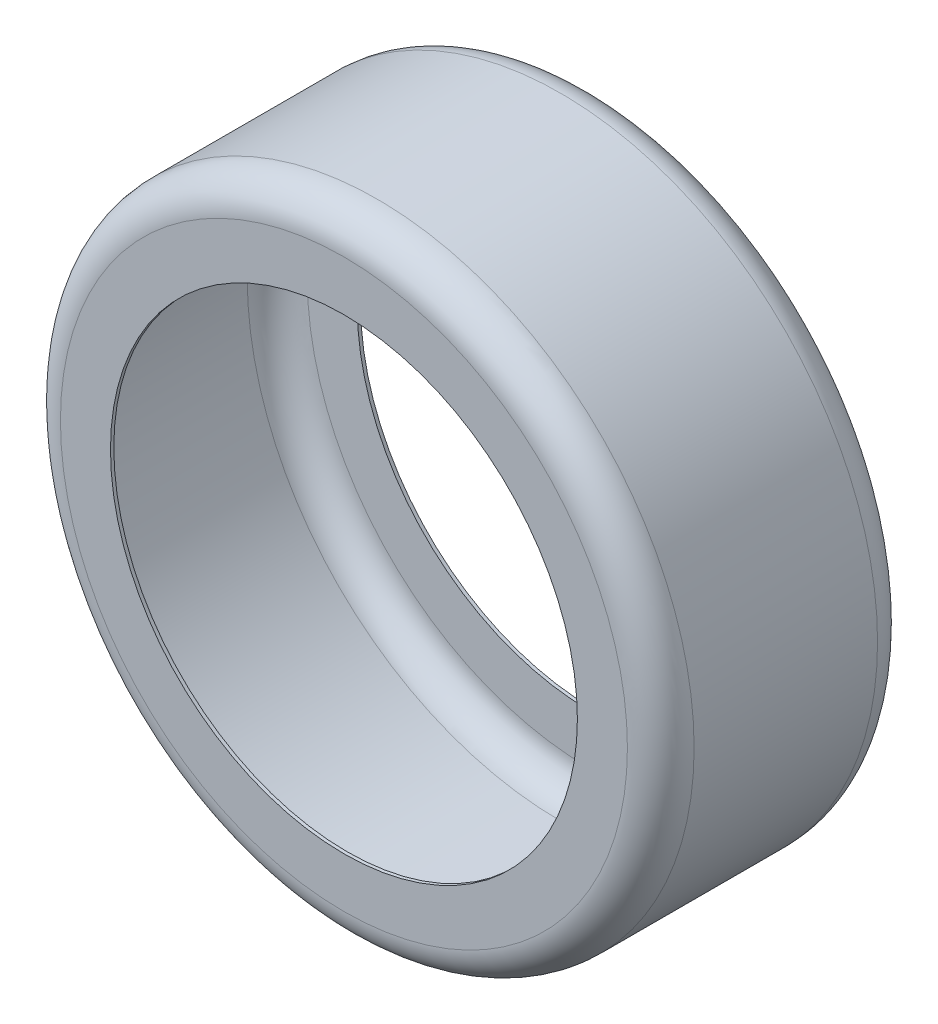
ISO-10303-21;
HEADER;
FILE_DESCRIPTION(('STEP AP214'),'2;1');
FILE_NAME('part.step','',(''),(''),'','','');
FILE_SCHEMA(('AUTOMOTIVE_DESIGN { 1 0 10303 214 1 1 1 1 }'));
ENDSEC;
DATA;
#1=APPLICATION_CONTEXT('core data for automotive mechanical design processes');
#2=APPLICATION_PROTOCOL_DEFINITION('international standard','automotive_design',2000,#1);
#3=PRODUCT_CONTEXT('',#1,'mechanical');
#4=PRODUCT('Part','Part','',(#3));
#5=PRODUCT_RELATED_PRODUCT_CATEGORY('part','',(#4));
#6=PRODUCT_DEFINITION_FORMATION('','',#4);
#7=PRODUCT_DEFINITION_CONTEXT('part definition',#1,'design');
#8=PRODUCT_DEFINITION('design','',#6,#7);
#9=PRODUCT_DEFINITION_SHAPE('','',#8);
#10=(LENGTH_UNIT() NAMED_UNIT(*) SI_UNIT(.MILLI.,.METRE.));
#11=(NAMED_UNIT(*) PLANE_ANGLE_UNIT() SI_UNIT($,.RADIAN.));
#12=(NAMED_UNIT(*) SI_UNIT($,.STERADIAN.) SOLID_ANGLE_UNIT());
#13=UNCERTAINTY_MEASURE_WITH_UNIT(LENGTH_MEASURE(1.E-05),#10,'distance_accuracy_value','');
#14=(GEOMETRIC_REPRESENTATION_CONTEXT(3) GLOBAL_UNCERTAINTY_ASSIGNED_CONTEXT((#13)) GLOBAL_UNIT_ASSIGNED_CONTEXT((#10,
#11,#12)) REPRESENTATION_CONTEXT('',''));
#15=CARTESIAN_POINT('',(0.,0.,0.));
#16=DIRECTION('',(0.,0.,1.));
#17=DIRECTION('',(1.,0.,0.));
#18=AXIS2_PLACEMENT_3D('',#15,#16,#17);
#19=CARTESIAN_POINT('',(0.,0.,75.));
#20=DIRECTION('',(0.,0.,-1.));
#21=DIRECTION('',(-1.,0.,0.));
#22=AXIS2_PLACEMENT_3D('',#19,#20,#21);
#23=CYLINDRICAL_SURFACE('',#22,140.);
#24=CARTESIAN_POINT('',(0.,0.,-75.));
#25=DIRECTION('',(0.,0.,1.));
#26=DIRECTION('',(1.,0.,0.));
#27=AXIS2_PLACEMENT_3D('',#24,#25,#26);
#28=CIRCLE('',#27,140.);
#29=CARTESIAN_POINT('',(140.,0.,-75.));
#30=VERTEX_POINT('',#29);
#31=EDGE_CURVE('E54',#30,#30,#28,.T.);
#32=ORIENTED_EDGE('',*,*,#31,.F.);
#33=EDGE_LOOP('',(#32));
#34=FACE_BOUND('',#33,.T.);
#35=CARTESIAN_POINT('',(0.,0.,-73.));
#36=DIRECTION('',(0.,0.,1.));
#37=DIRECTION('',(1.,0.,0.));
#38=AXIS2_PLACEMENT_3D('',#35,#36,#37);
#39=CIRCLE('',#38,140.);
#40=CARTESIAN_POINT('',(140.,0.,-73.));
#41=VERTEX_POINT('',#40);
#42=EDGE_CURVE('E60',#41,#41,#39,.T.);
#43=ORIENTED_EDGE('',*,*,#42,.T.);
#44=EDGE_LOOP('',(#43));
#45=FACE_BOUND('',#44,.T.);
#46=ADVANCED_FACE('F33',(#34,#45),#23,.F.);
#47=CARTESIAN_POINT('',(0.,0.,75.));
#48=DIRECTION('',(0.,0.,1.));
#49=DIRECTION('',(1.,0.,0.));
#50=AXIS2_PLACEMENT_3D('',#47,#48,#49);
#51=PLANE('',#50);
#52=CARTESIAN_POINT('',(0.,0.,75.));
#53=DIRECTION('',(0.,0.,1.));
#54=DIRECTION('',(1.,0.,0.));
#55=AXIS2_PLACEMENT_3D('',#52,#53,#54);
#56=CIRCLE('',#55,170.);
#57=CARTESIAN_POINT('',(170.,0.,75.));
#58=VERTEX_POINT('',#57);
#59=EDGE_CURVE('E48',#58,#58,#56,.T.);
#60=ORIENTED_EDGE('',*,*,#59,.T.);
#61=EDGE_LOOP('',(#60));
#62=FACE_BOUND('',#61,.T.);
#63=CARTESIAN_POINT('',(0.,0.,75.));
#64=DIRECTION('',(0.,0.,1.));
#65=DIRECTION('',(1.,0.,0.));
#66=AXIS2_PLACEMENT_3D('',#63,#64,#65);
#67=CIRCLE('',#66,140.);
#68=CARTESIAN_POINT('',(140.,0.,75.));
#69=VERTEX_POINT('',#68);
#70=EDGE_CURVE('E53',#69,#69,#67,.T.);
#71=ORIENTED_EDGE('',*,*,#70,.F.);
#72=EDGE_LOOP('',(#71));
#73=FACE_BOUND('',#72,.T.);
#74=ADVANCED_FACE('F95',(#62,#73),#51,.T.);
#75=CARTESIAN_POINT('',(0.,0.,-75.));
#76=DIRECTION('',(0.,0.,1.));
#77=DIRECTION('',(1.,0.,0.));
#78=AXIS2_PLACEMENT_3D('',#75,#76,#77);
#79=PLANE('',#78);
#80=CARTESIAN_POINT('',(0.,0.,-75.));
#81=DIRECTION('',(0.,0.,1.));
#82=DIRECTION('',(1.,0.,0.));
#83=AXIS2_PLACEMENT_3D('',#80,#81,#82);
#84=CIRCLE('',#83,170.);
#85=CARTESIAN_POINT('',(170.,0.,-75.));
#86=VERTEX_POINT('',#85);
#87=EDGE_CURVE('E10',#86,#86,#84,.F.);
#88=ORIENTED_EDGE('',*,*,#87,.T.);
#89=EDGE_LOOP('',(#88));
#90=FACE_BOUND('',#89,.T.);
#91=ORIENTED_EDGE('',*,*,#31,.T.);
#92=EDGE_LOOP('',(#91));
#93=FACE_BOUND('',#92,.T.);
#94=ADVANCED_FACE('F97',(#90,#93),#79,.F.);
#95=CARTESIAN_POINT('',(0.,0.,75.));
#96=DIRECTION('',(0.,0.,-1.));
#97=DIRECTION('',(-1.,0.,0.));
#98=AXIS2_PLACEMENT_3D('',#95,#96,#97);
#99=CYLINDRICAL_SURFACE('',#98,190.);
#100=CARTESIAN_POINT('',(0.,0.,55.));
#101=DIRECTION('',(0.,0.,1.));
#102=DIRECTION('',(1.,0.,0.));
#103=AXIS2_PLACEMENT_3D('',#100,#101,#102);
#104=CIRCLE('',#103,190.);
#105=CARTESIAN_POINT('',(190.,0.,55.));
#106=VERTEX_POINT('',#105);
#107=EDGE_CURVE('E40',#106,#106,#104,.F.);
#108=ORIENTED_EDGE('',*,*,#107,.T.);
#109=EDGE_LOOP('',(#108));
#110=FACE_BOUND('',#109,.T.);
#111=CARTESIAN_POINT('',(0.,0.,-55.));
#112=DIRECTION('',(0.,0.,1.));
#113=DIRECTION('',(1.,0.,0.));
#114=AXIS2_PLACEMENT_3D('',#111,#112,#113);
#115=CIRCLE('',#114,190.);
#116=CARTESIAN_POINT('',(190.,0.,-55.));
#117=VERTEX_POINT('',#116);
#118=EDGE_CURVE('E44',#117,#117,#115,.T.);
#119=ORIENTED_EDGE('',*,*,#118,.T.);
#120=EDGE_LOOP('',(#119));
#121=FACE_BOUND('',#120,.T.);
#122=ADVANCED_FACE('F91',(#110,#121),#99,.T.);
#123=CARTESIAN_POINT('',(0.,0.,73.));
#124=DIRECTION('',(0.,0.,1.));
#125=DIRECTION('',(1.,0.,0.));
#126=AXIS2_PLACEMENT_3D('',#123,#124,#125);
#127=CIRCLE('',#126,140.);
#128=CARTESIAN_POINT('',(140.,0.,73.));
#129=VERTEX_POINT('',#128);
#130=EDGE_CURVE('E63',#129,#129,#127,.T.);
#131=ORIENTED_EDGE('',*,*,#130,.F.);
#132=EDGE_LOOP('',(#131));
#133=FACE_BOUND('',#132,.T.);
#134=ORIENTED_EDGE('',*,*,#70,.T.);
#135=EDGE_LOOP('',(#134));
#136=FACE_BOUND('',#135,.T.);
#137=ADVANCED_FACE('F87',(#133,#136),#23,.F.);
#138=CARTESIAN_POINT('',(0.,0.,55.));
#139=DIRECTION('',(0.,0.,1.));
#140=DIRECTION('',(1.,0.,0.));
#141=AXIS2_PLACEMENT_3D('',#138,#139,#140);
#142=TOROIDAL_SURFACE('',#141,170.,20.);
#143=ORIENTED_EDGE('',*,*,#107,.F.);
#144=EDGE_LOOP('',(#143));
#145=FACE_BOUND('',#144,.T.);
#146=ORIENTED_EDGE('',*,*,#59,.F.);
#147=EDGE_LOOP('',(#146));
#148=FACE_BOUND('',#147,.T.);
#149=ADVANCED_FACE('F90',(#145,#148),#142,.T.);
#150=CARTESIAN_POINT('',(0.,0.,-55.));
#151=DIRECTION('',(0.,0.,1.));
#152=DIRECTION('',(1.,0.,0.));
#153=AXIS2_PLACEMENT_3D('',#150,#151,#152);
#154=TOROIDAL_SURFACE('',#153,170.,20.);
#155=ORIENTED_EDGE('',*,*,#87,.F.);
#156=EDGE_LOOP('',(#155));
#157=FACE_BOUND('',#156,.T.);
#158=ORIENTED_EDGE('',*,*,#118,.F.);
#159=EDGE_LOOP('',(#158));
#160=FACE_BOUND('',#159,.T.);
#161=ADVANCED_FACE('F35',(#157,#160),#154,.T.);
#162=CARTESIAN_POINT('',(0.,0.,73.));
#163=DIRECTION('',(0.,0.,1.));
#164=DIRECTION('',(1.,0.,0.));
#165=AXIS2_PLACEMENT_3D('',#162,#163,#164);
#166=PLANE('',#165);
#167=CARTESIAN_POINT('',(0.,0.,73.));
#168=DIRECTION('',(0.,0.,1.));
#169=DIRECTION('',(1.,0.,0.));
#170=AXIS2_PLACEMENT_3D('',#167,#168,#169);
#171=CIRCLE('',#170,170.);
#172=CARTESIAN_POINT('',(170.,0.,73.));
#173=VERTEX_POINT('',#172);
#174=EDGE_CURVE('E66',#173,#173,#171,.T.);
#175=ORIENTED_EDGE('',*,*,#174,.F.);
#176=EDGE_LOOP('',(#175));
#177=FACE_BOUND('',#176,.T.);
#178=ORIENTED_EDGE('',*,*,#130,.T.);
#179=EDGE_LOOP('',(#178));
#180=FACE_BOUND('',#179,.T.);
#181=ADVANCED_FACE('F80',(#177,#180),#166,.F.);
#182=CARTESIAN_POINT('',(0.,0.,-73.));
#183=DIRECTION('',(0.,0.,1.));
#184=DIRECTION('',(1.,0.,0.));
#185=AXIS2_PLACEMENT_3D('',#182,#183,#184);
#186=PLANE('',#185);
#187=CARTESIAN_POINT('',(0.,0.,-73.));
#188=DIRECTION('',(0.,0.,1.));
#189=DIRECTION('',(1.,0.,0.));
#190=AXIS2_PLACEMENT_3D('',#187,#188,#189);
#191=CIRCLE('',#190,170.);
#192=CARTESIAN_POINT('',(170.,0.,-73.));
#193=VERTEX_POINT('',#192);
#194=EDGE_CURVE('E57',#193,#193,#191,.F.);
#195=ORIENTED_EDGE('',*,*,#194,.F.);
#196=EDGE_LOOP('',(#195));
#197=FACE_BOUND('',#196,.T.);
#198=ORIENTED_EDGE('',*,*,#42,.F.);
#199=EDGE_LOOP('',(#198));
#200=FACE_BOUND('',#199,.T.);
#201=ADVANCED_FACE('F83',(#197,#200),#186,.T.);
#202=CARTESIAN_POINT('',(0.,0.,75.));
#203=DIRECTION('',(0.,0.,-1.));
#204=DIRECTION('',(-1.,0.,0.));
#205=AXIS2_PLACEMENT_3D('',#202,#203,#204);
#206=CYLINDRICAL_SURFACE('',#205,188.);
#207=CARTESIAN_POINT('',(0.,0.,55.));
#208=DIRECTION('',(0.,0.,-1.));
#209=DIRECTION('',(-1.,0.,0.));
#210=AXIS2_PLACEMENT_3D('',#207,#208,#209);
#211=CIRCLE('',#210,188.);
#212=CARTESIAN_POINT('',(-188.,0.,55.));
#213=VERTEX_POINT('',#212);
#214=EDGE_CURVE('E69',#213,#213,#211,.T.);
#215=ORIENTED_EDGE('',*,*,#214,.F.);
#216=EDGE_LOOP('',(#215));
#217=FACE_BOUND('',#216,.T.);
#218=CARTESIAN_POINT('',(0.,0.,-55.));
#219=DIRECTION('',(0.,0.,-1.));
#220=DIRECTION('',(-1.,0.,0.));
#221=AXIS2_PLACEMENT_3D('',#218,#219,#220);
#222=CIRCLE('',#221,188.);
#223=CARTESIAN_POINT('',(-188.,0.,-55.));
#224=VERTEX_POINT('',#223);
#225=EDGE_CURVE('E70',#224,#224,#222,.F.);
#226=ORIENTED_EDGE('',*,*,#225,.F.);
#227=EDGE_LOOP('',(#226));
#228=FACE_BOUND('',#227,.T.);
#229=ADVANCED_FACE('F134',(#217,#228),#206,.F.);
#230=CARTESIAN_POINT('',(0.,0.,55.));
#231=DIRECTION('',(0.,0.,1.));
#232=DIRECTION('',(1.,0.,0.));
#233=AXIS2_PLACEMENT_3D('',#230,#231,#232);
#234=TOROIDAL_SURFACE('',#233,170.,18.);
#235=ORIENTED_EDGE('',*,*,#214,.T.);
#236=EDGE_LOOP('',(#235));
#237=FACE_BOUND('',#236,.T.);
#238=ORIENTED_EDGE('',*,*,#174,.T.);
#239=EDGE_LOOP('',(#238));
#240=FACE_BOUND('',#239,.T.);
#241=ADVANCED_FACE('F78',(#237,#240),#234,.F.);
#242=CARTESIAN_POINT('',(0.,0.,-55.));
#243=DIRECTION('',(0.,0.,1.));
#244=DIRECTION('',(1.,0.,0.));
#245=AXIS2_PLACEMENT_3D('',#242,#243,#244);
#246=TOROIDAL_SURFACE('',#245,170.,18.);
#247=ORIENTED_EDGE('',*,*,#194,.T.);
#248=EDGE_LOOP('',(#247));
#249=FACE_BOUND('',#248,.T.);
#250=ORIENTED_EDGE('',*,*,#225,.T.);
#251=EDGE_LOOP('',(#250));
#252=FACE_BOUND('',#251,.T.);
#253=ADVANCED_FACE('F149',(#249,#252),#246,.F.);
#254=CLOSED_SHELL('',(#46,#74,#94,#122,#137,#149,#161,#181,#201,#229,#241,#253));
#255=MANIFOLD_SOLID_BREP('B2',#254);
#256=ADVANCED_BREP_SHAPE_REPRESENTATION('',(#18,#255),#14);
#257=SHAPE_DEFINITION_REPRESENTATION(#9,#256);
ENDSEC;
END-ISO-10303-21;
